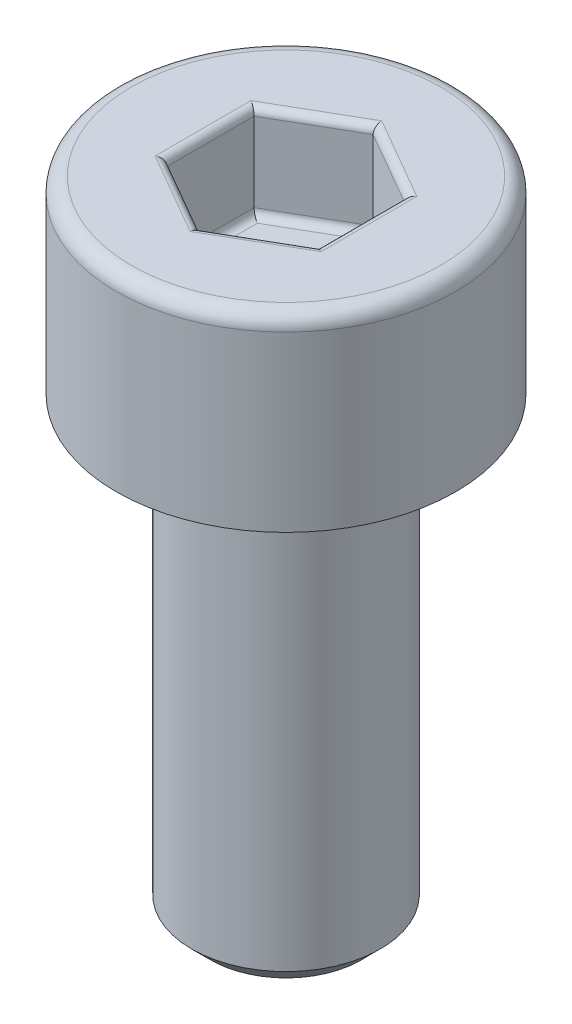
ISO-10303-21;
HEADER;
FILE_DESCRIPTION(('STEP AP214'),'2;1');
FILE_NAME('part.step','',(''),(''),'','','');
FILE_SCHEMA(('AUTOMOTIVE_DESIGN { 1 0 10303 214 1 1 1 1 }'));
ENDSEC;
DATA;
#1=APPLICATION_CONTEXT('core data for automotive mechanical design processes');
#2=APPLICATION_PROTOCOL_DEFINITION('international standard','automotive_design',2000,#1);
#3=PRODUCT_CONTEXT('',#1,'mechanical');
#4=PRODUCT('Part','Part','',(#3));
#5=PRODUCT_RELATED_PRODUCT_CATEGORY('part','',(#4));
#6=PRODUCT_DEFINITION_FORMATION('','',#4);
#7=PRODUCT_DEFINITION_CONTEXT('part definition',#1,'design');
#8=PRODUCT_DEFINITION('design','',#6,#7);
#9=PRODUCT_DEFINITION_SHAPE('','',#8);
#10=(LENGTH_UNIT() NAMED_UNIT(*) SI_UNIT(.MILLI.,.METRE.));
#11=(NAMED_UNIT(*) PLANE_ANGLE_UNIT() SI_UNIT($,.RADIAN.));
#12=(NAMED_UNIT(*) SI_UNIT($,.STERADIAN.) SOLID_ANGLE_UNIT());
#13=UNCERTAINTY_MEASURE_WITH_UNIT(LENGTH_MEASURE(1.E-05),#10,'distance_accuracy_value','');
#14=(GEOMETRIC_REPRESENTATION_CONTEXT(3) GLOBAL_UNCERTAINTY_ASSIGNED_CONTEXT((#13)) GLOBAL_UNIT_ASSIGNED_CONTEXT((#10,
#11,#12)) REPRESENTATION_CONTEXT('',''));
#15=CARTESIAN_POINT('',(0.,0.,0.));
#16=DIRECTION('',(0.,0.,1.));
#17=DIRECTION('',(1.,0.,0.));
#18=AXIS2_PLACEMENT_3D('',#15,#16,#17);
#19=CARTESIAN_POINT('',(0.,-8.5,0.));
#20=DIRECTION('',(0.,-1.,0.));
#21=DIRECTION('',(0.,0.,-1.));
#22=AXIS2_PLACEMENT_3D('',#19,#20,#21);
#23=PLANE('',#22);
#24=CARTESIAN_POINT('',(0.,-8.5,0.));
#25=DIRECTION('',(0.,-1.,0.));
#26=DIRECTION('',(0.,0.,-1.));
#27=AXIS2_PLACEMENT_3D('',#24,#25,#26);
#28=CIRCLE('',#27,0.999999999999993);
#29=CARTESIAN_POINT('',(0.,-8.5,-0.999999999999993));
#30=VERTEX_POINT('',#29);
#31=EDGE_CURVE('E261',#30,#30,#28,.T.);
#32=ORIENTED_EDGE('',*,*,#31,.T.);
#33=EDGE_LOOP('',(#32));
#34=FACE_BOUND('',#33,.T.);
#35=ADVANCED_FACE('F33',(#34),#23,.T.);
#36=CARTESIAN_POINT('',(0.,0.,0.));
#37=DIRECTION('',(0.,1.,0.));
#38=DIRECTION('',(0.,0.,1.));
#39=AXIS2_PLACEMENT_3D('',#36,#37,#38);
#40=CYLINDRICAL_SURFACE('',#39,1.25);
#41=CARTESIAN_POINT('',(0.,-2.75,0.));
#42=DIRECTION('',(0.,-1.,0.));
#43=DIRECTION('',(0.,0.,-1.));
#44=AXIS2_PLACEMENT_3D('',#41,#42,#43);
#45=CIRCLE('',#44,1.25);
#46=CARTESIAN_POINT('',(0.,-2.75,-1.25));
#47=VERTEX_POINT('',#46);
#48=EDGE_CURVE('E258',#47,#47,#45,.T.);
#49=ORIENTED_EDGE('',*,*,#48,.T.);
#50=EDGE_LOOP('',(#49));
#51=FACE_BOUND('',#50,.T.);
#52=CARTESIAN_POINT('',(0.,-8.25,0.));
#53=DIRECTION('',(0.,-1.,0.));
#54=DIRECTION('',(0.,0.,-1.));
#55=AXIS2_PLACEMENT_3D('',#52,#53,#54);
#56=CIRCLE('',#55,1.25);
#57=CARTESIAN_POINT('',(0.,-8.25,-1.25));
#58=VERTEX_POINT('',#57);
#59=EDGE_CURVE('E255',#58,#58,#56,.F.);
#60=ORIENTED_EDGE('',*,*,#59,.T.);
#61=EDGE_LOOP('',(#60));
#62=FACE_BOUND('',#61,.T.);
#63=ADVANCED_FACE('F287',(#51,#62),#40,.T.);
#64=CARTESIAN_POINT('',(-1.25,-2.5,0.));
#65=DIRECTION('',(0.,-1.,0.));
#66=DIRECTION('',(0.,0.,-1.));
#67=AXIS2_PLACEMENT_3D('',#64,#65,#66);
#68=PLANE('',#67);
#69=CARTESIAN_POINT('',(0.,-2.5,0.));
#70=DIRECTION('',(0.,-1.,0.));
#71=DIRECTION('',(0.,0.,-1.));
#72=AXIS2_PLACEMENT_3D('',#69,#70,#71);
#73=CIRCLE('',#72,1.5);
#74=CARTESIAN_POINT('',(0.,-2.5,-1.5));
#75=VERTEX_POINT('',#74);
#76=EDGE_CURVE('E252',#75,#75,#73,.F.);
#77=ORIENTED_EDGE('',*,*,#76,.T.);
#78=EDGE_LOOP('',(#77));
#79=FACE_BOUND('',#78,.T.);
#80=CARTESIAN_POINT('',(0.,-2.5,0.));
#81=DIRECTION('',(0.,1.,0.));
#82=DIRECTION('',(0.,0.,1.));
#83=AXIS2_PLACEMENT_3D('',#80,#81,#82);
#84=CIRCLE('',#83,2.25);
#85=CARTESIAN_POINT('',(0.,-2.5,2.25));
#86=VERTEX_POINT('',#85);
#87=EDGE_CURVE('E249',#86,#86,#84,.T.);
#88=ORIENTED_EDGE('',*,*,#87,.F.);
#89=EDGE_LOOP('',(#88));
#90=FACE_BOUND('',#89,.T.);
#91=ADVANCED_FACE('F293',(#79,#90),#68,.T.);
#92=CARTESIAN_POINT('',(0.,0.,0.));
#93=DIRECTION('',(0.,1.,0.));
#94=DIRECTION('',(0.,0.,1.));
#95=AXIS2_PLACEMENT_3D('',#92,#93,#94);
#96=CYLINDRICAL_SURFACE('',#95,2.25);
#97=CARTESIAN_POINT('',(0.,-0.2,0.));
#98=DIRECTION('',(0.,1.,0.));
#99=DIRECTION('',(0.,0.,1.));
#100=AXIS2_PLACEMENT_3D('',#97,#98,#99);
#101=CIRCLE('',#100,2.25);
#102=CARTESIAN_POINT('',(0.,-0.2,2.25));
#103=VERTEX_POINT('',#102);
#104=EDGE_CURVE('E159',#103,#103,#101,.F.);
#105=ORIENTED_EDGE('',*,*,#104,.T.);
#106=EDGE_LOOP('',(#105));
#107=FACE_BOUND('',#106,.T.);
#108=ORIENTED_EDGE('',*,*,#87,.T.);
#109=EDGE_LOOP('',(#108));
#110=FACE_BOUND('',#109,.T.);
#111=ADVANCED_FACE('F303',(#107,#110),#96,.T.);
#112=CARTESIAN_POINT('',(-2.25,0.,0.));
#113=DIRECTION('',(0.,1.,0.));
#114=DIRECTION('',(0.,0.,1.));
#115=AXIS2_PLACEMENT_3D('',#112,#113,#114);
#116=PLANE('',#115);
#117=DIRECTION('',(0.,0.,1.));
#118=VECTOR('',#117,1.);
#119=CARTESIAN_POINT('',(-1.1,0.,-0.577350269189627));
#120=LINE('',#119,#118);
#121=CARTESIAN_POINT('',(-1.1,0.,0.635085296108588));
#122=VERTEX_POINT('',#121);
#123=CARTESIAN_POINT('',(-1.1,0.,-0.635085296108589));
#124=VERTEX_POINT('',#123);
#125=EDGE_CURVE('E175',#122,#124,#120,.F.);
#126=ORIENTED_EDGE('',*,*,#125,.T.);
#127=DIRECTION('',(-0.866025403784439,0.,0.5));
#128=VECTOR('',#127,1.);
#129=CARTESIAN_POINT('',(-0.0500000000000009,0.,-1.2413030787577));
#130=LINE('',#129,#128);
#131=CARTESIAN_POINT('',(0.,0.,-1.27017059221718));
#132=VERTEX_POINT('',#131);
#133=EDGE_CURVE('E134',#124,#132,#130,.F.);
#134=ORIENTED_EDGE('',*,*,#133,.T.);
#135=DIRECTION('',(-0.866025403784439,0.,-0.5));
#136=VECTOR('',#135,1.);
#137=CARTESIAN_POINT('',(1.05,0.,-0.663952809568071));
#138=LINE('',#137,#136);
#139=CARTESIAN_POINT('',(1.1,0.,-0.63508529610859));
#140=VERTEX_POINT('',#139);
#141=EDGE_CURVE('E161',#132,#140,#138,.F.);
#142=ORIENTED_EDGE('',*,*,#141,.T.);
#143=DIRECTION('',(0.,0.,-1.));
#144=VECTOR('',#143,1.);
#145=CARTESIAN_POINT('',(1.1,0.,0.577350269189625));
#146=LINE('',#145,#144);
#147=CARTESIAN_POINT('',(1.1,0.,0.635085296108588));
#148=VERTEX_POINT('',#147);
#149=EDGE_CURVE('E169',#140,#148,#146,.F.);
#150=ORIENTED_EDGE('',*,*,#149,.T.);
#151=DIRECTION('',(0.866025403784439,0.,-0.5));
#152=VECTOR('',#151,1.);
#153=CARTESIAN_POINT('',(0.0499999999999991,0.,1.24130307875769));
#154=LINE('',#153,#152);
#155=CARTESIAN_POINT('',(0.,0.,1.27017059221718));
#156=VERTEX_POINT('',#155);
#157=EDGE_CURVE('E171',#148,#156,#154,.F.);
#158=ORIENTED_EDGE('',*,*,#157,.T.);
#159=DIRECTION('',(0.866025403784439,0.,0.5));
#160=VECTOR('',#159,1.);
#161=CARTESIAN_POINT('',(-1.05,0.,0.663952809568069));
#162=LINE('',#161,#160);
#163=EDGE_CURVE('E173',#156,#122,#162,.F.);
#164=ORIENTED_EDGE('',*,*,#163,.T.);
#165=EDGE_LOOP('',(#126,#134,#142,#150,#158,#164));
#166=FACE_BOUND('',#165,.T.);
#167=CARTESIAN_POINT('',(0.,0.,0.));
#168=DIRECTION('',(0.,1.,0.));
#169=DIRECTION('',(0.,0.,1.));
#170=AXIS2_PLACEMENT_3D('',#167,#168,#169);
#171=CIRCLE('',#170,2.05);
#172=CARTESIAN_POINT('',(0.,0.,2.05));
#173=VERTEX_POINT('',#172);
#174=EDGE_CURVE('E164',#173,#173,#171,.T.);
#175=ORIENTED_EDGE('',*,*,#174,.T.);
#176=EDGE_LOOP('',(#175));
#177=FACE_BOUND('',#176,.T.);
#178=ADVANCED_FACE('F266',(#166,#177),#116,.T.);
#179=CARTESIAN_POINT('',(0.,-2.5,0.));
#180=DIRECTION('',(0.,1.,0.));
#181=DIRECTION('',(0.,0.,1.));
#182=AXIS2_PLACEMENT_3D('',#179,#180,#181);
#183=CONICAL_SURFACE('',#182,1.5,0.785398163397454);
#184=ORIENTED_EDGE('',*,*,#48,.F.);
#185=EDGE_LOOP('',(#184));
#186=FACE_BOUND('',#185,.T.);
#187=ORIENTED_EDGE('',*,*,#76,.F.);
#188=EDGE_LOOP('',(#187));
#189=FACE_BOUND('',#188,.T.);
#190=ADVANCED_FACE('F281',(#186,#189),#183,.T.);
#191=CARTESIAN_POINT('',(0.,-8.25,0.));
#192=DIRECTION('',(0.,1.,0.));
#193=DIRECTION('',(0.,0.,1.));
#194=AXIS2_PLACEMENT_3D('',#191,#192,#193);
#195=CONICAL_SURFACE('',#194,1.25,0.785398163397456);
#196=ORIENTED_EDGE('',*,*,#31,.F.);
#197=EDGE_LOOP('',(#196));
#198=FACE_BOUND('',#197,.T.);
#199=ORIENTED_EDGE('',*,*,#59,.F.);
#200=EDGE_LOOP('',(#199));
#201=FACE_BOUND('',#200,.T.);
#202=ADVANCED_FACE('F271',(#198,#201),#195,.T.);
#203=CARTESIAN_POINT('',(0.,-0.2,0.));
#204=DIRECTION('',(0.,1.,0.));
#205=DIRECTION('',(0.,0.,1.));
#206=AXIS2_PLACEMENT_3D('',#203,#204,#205);
#207=TOROIDAL_SURFACE('',#206,2.05,0.2);
#208=ORIENTED_EDGE('',*,*,#104,.F.);
#209=EDGE_LOOP('',(#208));
#210=FACE_BOUND('',#209,.T.);
#211=ORIENTED_EDGE('',*,*,#174,.F.);
#212=EDGE_LOOP('',(#211));
#213=FACE_BOUND('',#212,.T.);
#214=ADVANCED_FACE('F268',(#210,#213),#207,.T.);
#215=CARTESIAN_POINT('',(0.999999999999998,-1.25,-0.577350269189627));
#216=DIRECTION('',(0.5,0.,-0.866025403784439));
#217=DIRECTION('',(-0.866025403784439,0.,-0.5));
#218=AXIS2_PLACEMENT_3D('',#215,#216,#217);
#219=PLANE('',#218);
#220=DIRECTION('',(0.,1.,0.));
#221=VECTOR('',#220,1.);
#222=CARTESIAN_POINT('',(0.999999999999998,-1.25,-0.577350269189627));
#223=LINE('',#222,#221);
#224=CARTESIAN_POINT('',(0.999999999999998,-1.15,-0.577350269189627));
#225=VERTEX_POINT('',#224);
#226=CARTESIAN_POINT('',(0.999999999999998,-0.1,-0.577350269189627));
#227=VERTEX_POINT('',#226);
#228=EDGE_CURVE('E243',#225,#227,#223,.T.);
#229=ORIENTED_EDGE('',*,*,#228,.T.);
#230=DIRECTION('',(-0.866025403784439,0.,-0.5));
#231=VECTOR('',#230,1.);
#232=CARTESIAN_POINT('',(0.,-0.1,-1.15470053837925));
#233=LINE('',#232,#231);
#234=CARTESIAN_POINT('',(0.,-0.1,-1.15470053837925));
#235=VERTEX_POINT('',#234);
#236=EDGE_CURVE('E195',#227,#235,#233,.T.);
#237=ORIENTED_EDGE('',*,*,#236,.T.);
#238=DIRECTION('',(0.,1.,0.));
#239=VECTOR('',#238,1.);
#240=CARTESIAN_POINT('',(0.,-1.25,-1.15470053837925));
#241=LINE('',#240,#239);
#242=CARTESIAN_POINT('',(0.,-1.15,-1.15470053837925));
#243=VERTEX_POINT('',#242);
#244=EDGE_CURVE('E145',#243,#235,#241,.T.);
#245=ORIENTED_EDGE('',*,*,#244,.F.);
#246=DIRECTION('',(-0.866025403784439,0.,-0.5));
#247=VECTOR('',#246,1.);
#248=CARTESIAN_POINT('',(0.999999999999998,-1.15,-0.577350269189627));
#249=LINE('',#248,#247);
#250=EDGE_CURVE('E193',#243,#225,#249,.F.);
#251=ORIENTED_EDGE('',*,*,#250,.T.);
#252=EDGE_LOOP('',(#229,#237,#245,#251));
#253=FACE_BOUND('',#252,.T.);
#254=ADVANCED_FACE('F270',(#253),#219,.F.);
#255=CARTESIAN_POINT('',(0.999999999999999,-1.25,0.577350269189625));
#256=DIRECTION('',(1.,0.,0.));
#257=DIRECTION('',(0.,0.,-1.));
#258=AXIS2_PLACEMENT_3D('',#255,#256,#257);
#259=PLANE('',#258);
#260=DIRECTION('',(0.,1.,0.));
#261=VECTOR('',#260,1.);
#262=CARTESIAN_POINT('',(0.999999999999999,-1.25,0.577350269189625));
#263=LINE('',#262,#261);
#264=CARTESIAN_POINT('',(0.999999999999999,-1.15,0.577350269189625));
#265=VERTEX_POINT('',#264);
#266=CARTESIAN_POINT('',(0.999999999999999,-0.1,0.577350269189625));
#267=VERTEX_POINT('',#266);
#268=EDGE_CURVE('E240',#265,#267,#263,.T.);
#269=ORIENTED_EDGE('',*,*,#268,.T.);
#270=DIRECTION('',(0.,0.,-1.));
#271=VECTOR('',#270,1.);
#272=CARTESIAN_POINT('',(0.999999999999998,-0.1,-0.577350269189627));
#273=LINE('',#272,#271);
#274=EDGE_CURVE('E191',#267,#227,#273,.T.);
#275=ORIENTED_EDGE('',*,*,#274,.T.);
#276=ORIENTED_EDGE('',*,*,#228,.F.);
#277=DIRECTION('',(0.,0.,-1.));
#278=VECTOR('',#277,1.);
#279=CARTESIAN_POINT('',(0.999999999999999,-1.15,0.577350269189625));
#280=LINE('',#279,#278);
#281=EDGE_CURVE('E188',#225,#265,#280,.F.);
#282=ORIENTED_EDGE('',*,*,#281,.T.);
#283=EDGE_LOOP('',(#269,#275,#276,#282));
#284=FACE_BOUND('',#283,.T.);
#285=ADVANCED_FACE('F278',(#284),#259,.F.);
#286=CARTESIAN_POINT('',(0.,-1.25,1.15470053837925));
#287=DIRECTION('',(0.5,0.,0.866025403784439));
#288=DIRECTION('',(0.866025403784439,0.,-0.5));
#289=AXIS2_PLACEMENT_3D('',#286,#287,#288);
#290=PLANE('',#289);
#291=DIRECTION('',(0.,1.,0.));
#292=VECTOR('',#291,1.);
#293=CARTESIAN_POINT('',(0.,-1.25,1.15470053837925));
#294=LINE('',#293,#292);
#295=CARTESIAN_POINT('',(0.,-1.15,1.15470053837925));
#296=VERTEX_POINT('',#295);
#297=CARTESIAN_POINT('',(0.,-0.1,1.15470053837925));
#298=VERTEX_POINT('',#297);
#299=EDGE_CURVE('E237',#296,#298,#294,.T.);
#300=ORIENTED_EDGE('',*,*,#299,.T.);
#301=DIRECTION('',(0.866025403784439,0.,-0.5));
#302=VECTOR('',#301,1.);
#303=CARTESIAN_POINT('',(0.999999999999999,-0.1,0.577350269189625));
#304=LINE('',#303,#302);
#305=EDGE_CURVE('E186',#298,#267,#304,.T.);
#306=ORIENTED_EDGE('',*,*,#305,.T.);
#307=ORIENTED_EDGE('',*,*,#268,.F.);
#308=DIRECTION('',(0.866025403784439,0.,-0.5));
#309=VECTOR('',#308,1.);
#310=CARTESIAN_POINT('',(0.,-1.15,1.15470053837925));
#311=LINE('',#310,#309);
#312=EDGE_CURVE('E184',#265,#296,#311,.F.);
#313=ORIENTED_EDGE('',*,*,#312,.T.);
#314=EDGE_LOOP('',(#300,#306,#307,#313));
#315=FACE_BOUND('',#314,.T.);
#316=ADVANCED_FACE('F327',(#315),#290,.F.);
#317=CARTESIAN_POINT('',(-1.,-1.25,0.577350269189625));
#318=DIRECTION('',(-0.5,0.,0.866025403784438));
#319=DIRECTION('',(0.866025403784439,0.,0.5));
#320=AXIS2_PLACEMENT_3D('',#317,#318,#319);
#321=PLANE('',#320);
#322=DIRECTION('',(0.,1.,0.));
#323=VECTOR('',#322,1.);
#324=CARTESIAN_POINT('',(-1.,-1.25,0.577350269189625));
#325=LINE('',#324,#323);
#326=CARTESIAN_POINT('',(-1.,-1.15,0.577350269189625));
#327=VERTEX_POINT('',#326);
#328=CARTESIAN_POINT('',(-1.,-0.1,0.577350269189625));
#329=VERTEX_POINT('',#328);
#330=EDGE_CURVE('E128',#327,#329,#325,.T.);
#331=ORIENTED_EDGE('',*,*,#330,.T.);
#332=DIRECTION('',(0.866025403784439,0.,0.5));
#333=VECTOR('',#332,1.);
#334=CARTESIAN_POINT('',(0.,-0.1,1.15470053837925));
#335=LINE('',#334,#333);
#336=EDGE_CURVE('E182',#329,#298,#335,.T.);
#337=ORIENTED_EDGE('',*,*,#336,.T.);
#338=ORIENTED_EDGE('',*,*,#299,.F.);
#339=DIRECTION('',(0.866025403784439,0.,0.5));
#340=VECTOR('',#339,1.);
#341=CARTESIAN_POINT('',(-1.,-1.15,0.577350269189625));
#342=LINE('',#341,#340);
#343=EDGE_CURVE('E180',#296,#327,#342,.F.);
#344=ORIENTED_EDGE('',*,*,#343,.T.);
#345=EDGE_LOOP('',(#331,#337,#338,#344));
#346=FACE_BOUND('',#345,.T.);
#347=ADVANCED_FACE('F234',(#346),#321,.F.);
#348=CARTESIAN_POINT('',(-1.,-1.25,-0.577350269189627));
#349=DIRECTION('',(-1.,0.,0.));
#350=DIRECTION('',(0.,0.,1.));
#351=AXIS2_PLACEMENT_3D('',#348,#349,#350);
#352=PLANE('',#351);
#353=DIRECTION('',(0.,1.,0.));
#354=VECTOR('',#353,1.);
#355=CARTESIAN_POINT('',(-1.,-1.25,-0.577350269189627));
#356=LINE('',#355,#354);
#357=CARTESIAN_POINT('',(-1.,-1.15,-0.577350269189627));
#358=VERTEX_POINT('',#357);
#359=CARTESIAN_POINT('',(-1.,-0.1,-0.577350269189627));
#360=VERTEX_POINT('',#359);
#361=EDGE_CURVE('E126',#358,#360,#356,.T.);
#362=ORIENTED_EDGE('',*,*,#361,.T.);
#363=DIRECTION('',(0.,0.,1.));
#364=VECTOR('',#363,1.);
#365=CARTESIAN_POINT('',(-1.,-0.1,0.577350269189625));
#366=LINE('',#365,#364);
#367=EDGE_CURVE('E133',#360,#329,#366,.T.);
#368=ORIENTED_EDGE('',*,*,#367,.T.);
#369=ORIENTED_EDGE('',*,*,#330,.F.);
#370=DIRECTION('',(0.,0.,1.));
#371=VECTOR('',#370,1.);
#372=CARTESIAN_POINT('',(-1.,-1.15,-0.577350269189627));
#373=LINE('',#372,#371);
#374=EDGE_CURVE('E123',#327,#358,#373,.F.);
#375=ORIENTED_EDGE('',*,*,#374,.T.);
#376=EDGE_LOOP('',(#362,#368,#369,#375));
#377=FACE_BOUND('',#376,.T.);
#378=ADVANCED_FACE('F125',(#377),#352,.F.);
#379=CARTESIAN_POINT('',(0.,-1.25,-1.15470053837925));
#380=DIRECTION('',(-0.5,0.,-0.866025403784438));
#381=DIRECTION('',(-0.866025403784439,0.,0.5));
#382=AXIS2_PLACEMENT_3D('',#379,#380,#381);
#383=PLANE('',#382);
#384=ORIENTED_EDGE('',*,*,#244,.T.);
#385=DIRECTION('',(-0.866025403784439,0.,0.5));
#386=VECTOR('',#385,1.);
#387=CARTESIAN_POINT('',(-1.,-0.1,-0.577350269189626));
#388=LINE('',#387,#386);
#389=EDGE_CURVE('E144',#235,#360,#388,.T.);
#390=ORIENTED_EDGE('',*,*,#389,.T.);
#391=ORIENTED_EDGE('',*,*,#361,.F.);
#392=DIRECTION('',(-0.866025403784439,0.,0.5));
#393=VECTOR('',#392,1.);
#394=CARTESIAN_POINT('',(0.,-1.15,-1.15470053837925));
#395=LINE('',#394,#393);
#396=EDGE_CURVE('E141',#358,#243,#395,.F.);
#397=ORIENTED_EDGE('',*,*,#396,.T.);
#398=EDGE_LOOP('',(#384,#390,#391,#397));
#399=FACE_BOUND('',#398,.T.);
#400=ADVANCED_FACE('F139',(#399),#383,.F.);
#401=CARTESIAN_POINT('',(0.,-1.25,-1.15470053837925));
#402=DIRECTION('',(0.,1.,0.));
#403=DIRECTION('',(0.,0.,1.));
#404=AXIS2_PLACEMENT_3D('',#401,#402,#403);
#405=PLANE('',#404);
#406=DIRECTION('',(0.866025403784439,0.,-0.5));
#407=VECTOR('',#406,1.);
#408=CARTESIAN_POINT('',(0.949999999999999,-1.25,0.490747728811181));
#409=LINE('',#408,#407);
#410=CARTESIAN_POINT('',(0.,-1.25,1.03923048454133));
#411=VERTEX_POINT('',#410);
#412=CARTESIAN_POINT('',(0.899999999999999,-1.25,0.519615242270663));
#413=VERTEX_POINT('',#412);
#414=EDGE_CURVE('E42',#411,#413,#409,.T.);
#415=ORIENTED_EDGE('',*,*,#414,.T.);
#416=DIRECTION('',(0.,0.,-1.));
#417=VECTOR('',#416,1.);
#418=CARTESIAN_POINT('',(0.899999999999998,-1.25,-1.15470053837925));
#419=LINE('',#418,#417);
#420=CARTESIAN_POINT('',(0.899999999999998,-1.25,-0.519615242270664));
#421=VERTEX_POINT('',#420);
#422=EDGE_CURVE('E11',#413,#421,#419,.T.);
#423=ORIENTED_EDGE('',*,*,#422,.T.);
#424=DIRECTION('',(-0.866025403784439,0.,-0.5));
#425=VECTOR('',#424,1.);
#426=CARTESIAN_POINT('',(-0.0500000000000008,-1.25,-1.06809799800081));
#427=LINE('',#426,#425);
#428=CARTESIAN_POINT('',(0.,-1.25,-1.03923048454133));
#429=VERTEX_POINT('',#428);
#430=EDGE_CURVE('E197',#421,#429,#427,.T.);
#431=ORIENTED_EDGE('',*,*,#430,.T.);
#432=DIRECTION('',(-0.866025403784439,0.,0.5));
#433=VECTOR('',#432,1.);
#434=CARTESIAN_POINT('',(0.0499999999999993,-1.25,-1.06809799800081));
#435=LINE('',#434,#433);
#436=CARTESIAN_POINT('',(-0.9,-1.25,-0.519615242270664));
#437=VERTEX_POINT('',#436);
#438=EDGE_CURVE('E199',#429,#437,#435,.T.);
#439=ORIENTED_EDGE('',*,*,#438,.T.);
#440=DIRECTION('',(0.,0.,1.));
#441=VECTOR('',#440,1.);
#442=CARTESIAN_POINT('',(-0.9,-1.25,-1.15470053837925));
#443=LINE('',#442,#441);
#444=CARTESIAN_POINT('',(-0.9,-1.25,0.519615242270662));
#445=VERTEX_POINT('',#444);
#446=EDGE_CURVE('E150',#437,#445,#443,.T.);
#447=ORIENTED_EDGE('',*,*,#446,.T.);
#448=DIRECTION('',(0.866025403784439,0.,0.5));
#449=VECTOR('',#448,1.);
#450=CARTESIAN_POINT('',(-0.950000000000001,-1.25,0.490747728811181));
#451=LINE('',#450,#449);
#452=EDGE_CURVE('E53',#445,#411,#451,.T.);
#453=ORIENTED_EDGE('',*,*,#452,.T.);
#454=EDGE_LOOP('',(#415,#423,#431,#439,#447,#453));
#455=FACE_BOUND('',#454,.T.);
#456=ADVANCED_FACE('F322',(#455),#405,.T.);
#457=CARTESIAN_POINT('',(0.0499999999999991,-0.1,1.24130307875769));
#458=DIRECTION('',(-0.866025403784439,0.,0.5));
#459=DIRECTION('',(0.5,0.,0.866025403784439));
#460=AXIS2_PLACEMENT_3D('',#457,#458,#459);
#461=CYLINDRICAL_SURFACE('',#460,0.1);
#462=CARTESIAN_POINT('',(0.,-0.1,1.27017059221718));
#463=DIRECTION('',(-1.,0.,0.));
#464=DIRECTION('',(0.,0.,-1.));
#465=AXIS2_PLACEMENT_3D('',#462,#463,#464);
#466=ELLIPSE('',#465,0.115470053837925,0.1);
#467=EDGE_CURVE('E214',#156,#298,#466,.T.);
#468=ORIENTED_EDGE('',*,*,#467,.F.);
#469=ORIENTED_EDGE('',*,*,#157,.F.);
#470=CARTESIAN_POINT('',(1.1,-0.1,0.635085296108588));
#471=DIRECTION('',(-0.5,0.,0.866025403784439));
#472=DIRECTION('',(-0.866025403784439,0.,-0.5));
#473=AXIS2_PLACEMENT_3D('',#470,#471,#472);
#474=ELLIPSE('',#473,0.115470053837925,0.1);
#475=EDGE_CURVE('E217',#267,#148,#474,.F.);
#476=ORIENTED_EDGE('',*,*,#475,.F.);
#477=ORIENTED_EDGE('',*,*,#305,.F.);
#478=EDGE_LOOP('',(#468,#469,#476,#477));
#479=FACE_BOUND('',#478,.T.);
#480=ADVANCED_FACE('F334',(#479),#461,.T.);
#481=CARTESIAN_POINT('',(1.1,-0.1,0.577350269189625));
#482=DIRECTION('',(0.,0.,1.));
#483=DIRECTION('',(1.,0.,0.));
#484=AXIS2_PLACEMENT_3D('',#481,#482,#483);
#485=CYLINDRICAL_SURFACE('',#484,0.1);
#486=ORIENTED_EDGE('',*,*,#475,.T.);
#487=ORIENTED_EDGE('',*,*,#149,.F.);
#488=CARTESIAN_POINT('',(1.1,-0.1,-0.63508529610859));
#489=DIRECTION('',(0.5,0.,0.866025403784439));
#490=DIRECTION('',(-0.866025403784439,0.,0.5));
#491=AXIS2_PLACEMENT_3D('',#488,#489,#490);
#492=ELLIPSE('',#491,0.115470053837925,0.1);
#493=EDGE_CURVE('E211',#227,#140,#492,.F.);
#494=ORIENTED_EDGE('',*,*,#493,.F.);
#495=ORIENTED_EDGE('',*,*,#274,.F.);
#496=EDGE_LOOP('',(#486,#487,#494,#495));
#497=FACE_BOUND('',#496,.T.);
#498=ADVANCED_FACE('F338',(#497),#485,.T.);
#499=CARTESIAN_POINT('',(-1.05,-0.1,0.663952809568069));
#500=DIRECTION('',(-0.866025403784439,0.,-0.5));
#501=DIRECTION('',(-0.5,0.,0.866025403784438));
#502=AXIS2_PLACEMENT_3D('',#499,#500,#501);
#503=CYLINDRICAL_SURFACE('',#502,0.1);
#504=ORIENTED_EDGE('',*,*,#467,.T.);
#505=ORIENTED_EDGE('',*,*,#336,.F.);
#506=CARTESIAN_POINT('',(-1.1,-0.1,0.635085296108587));
#507=DIRECTION('',(-0.5,0.,-0.866025403784439));
#508=DIRECTION('',(0.866025403784439,0.,-0.5));
#509=AXIS2_PLACEMENT_3D('',#506,#507,#508);
#510=ELLIPSE('',#509,0.115470053837925,0.1);
#511=EDGE_CURVE('E208',#122,#329,#510,.T.);
#512=ORIENTED_EDGE('',*,*,#511,.F.);
#513=ORIENTED_EDGE('',*,*,#163,.F.);
#514=EDGE_LOOP('',(#504,#505,#512,#513));
#515=FACE_BOUND('',#514,.T.);
#516=ADVANCED_FACE('F344',(#515),#503,.T.);
#517=CARTESIAN_POINT('',(1.05,-0.1,-0.663952809568071));
#518=DIRECTION('',(0.866025403784439,0.,0.5));
#519=DIRECTION('',(0.5,0.,-0.866025403784439));
#520=AXIS2_PLACEMENT_3D('',#517,#518,#519);
#521=CYLINDRICAL_SURFACE('',#520,0.1);
#522=ORIENTED_EDGE('',*,*,#493,.T.);
#523=ORIENTED_EDGE('',*,*,#141,.F.);
#524=CARTESIAN_POINT('',(0.,-0.1,-1.27017059221718));
#525=DIRECTION('',(1.,0.,0.));
#526=DIRECTION('',(0.,0.,-1.));
#527=AXIS2_PLACEMENT_3D('',#524,#525,#526);
#528=ELLIPSE('',#527,0.115470053837925,0.1);
#529=EDGE_CURVE('E206',#235,#132,#528,.F.);
#530=ORIENTED_EDGE('',*,*,#529,.F.);
#531=ORIENTED_EDGE('',*,*,#236,.F.);
#532=EDGE_LOOP('',(#522,#523,#530,#531));
#533=FACE_BOUND('',#532,.T.);
#534=ADVANCED_FACE('F374',(#533),#521,.T.);
#535=CARTESIAN_POINT('',(-1.1,-0.1,-0.577350269189627));
#536=DIRECTION('',(0.,0.,-1.));
#537=DIRECTION('',(-1.,0.,0.));
#538=AXIS2_PLACEMENT_3D('',#535,#536,#537);
#539=CYLINDRICAL_SURFACE('',#538,0.1);
#540=ORIENTED_EDGE('',*,*,#511,.T.);
#541=ORIENTED_EDGE('',*,*,#367,.F.);
#542=CARTESIAN_POINT('',(-1.1,-0.1,-0.635085296108589));
#543=DIRECTION('',(0.5,0.,-0.866025403784439));
#544=DIRECTION('',(0.866025403784439,0.,0.5));
#545=AXIS2_PLACEMENT_3D('',#542,#543,#544);
#546=ELLIPSE('',#545,0.115470053837925,0.1);
#547=EDGE_CURVE('E204',#124,#360,#546,.T.);
#548=ORIENTED_EDGE('',*,*,#547,.F.);
#549=ORIENTED_EDGE('',*,*,#125,.F.);
#550=EDGE_LOOP('',(#540,#541,#548,#549));
#551=FACE_BOUND('',#550,.T.);
#552=ADVANCED_FACE('F369',(#551),#539,.T.);
#553=CARTESIAN_POINT('',(-0.0500000000000009,-0.1,-1.2413030787577));
#554=DIRECTION('',(0.866025403784439,0.,-0.5));
#555=DIRECTION('',(-0.5,0.,-0.866025403784438));
#556=AXIS2_PLACEMENT_3D('',#553,#554,#555);
#557=CYLINDRICAL_SURFACE('',#556,0.1);
#558=ORIENTED_EDGE('',*,*,#529,.T.);
#559=ORIENTED_EDGE('',*,*,#133,.F.);
#560=ORIENTED_EDGE('',*,*,#547,.T.);
#561=ORIENTED_EDGE('',*,*,#389,.F.);
#562=EDGE_LOOP('',(#558,#559,#560,#561));
#563=FACE_BOUND('',#562,.T.);
#564=ADVANCED_FACE('F365',(#563),#557,.T.);
#565=CARTESIAN_POINT('',(-0.9,-1.15,-1.15470053837925));
#566=DIRECTION('',(0.,0.,1.));
#567=DIRECTION('',(1.,0.,0.));
#568=AXIS2_PLACEMENT_3D('',#565,#566,#567);
#569=CYLINDRICAL_SURFACE('',#568,0.1);
#570=CARTESIAN_POINT('',(-0.900000000000001,-1.15,-0.519615242270664));
#571=DIRECTION('',(-0.5,0.,0.866025403784439));
#572=DIRECTION('',(0.866025403784439,0.,0.5));
#573=AXIS2_PLACEMENT_3D('',#570,#571,#572);
#574=ELLIPSE('',#573,0.115470053837925,0.1);
#575=EDGE_CURVE('E149',#358,#437,#574,.T.);
#576=ORIENTED_EDGE('',*,*,#575,.F.);
#577=ORIENTED_EDGE('',*,*,#374,.F.);
#578=CARTESIAN_POINT('',(-0.9,-1.15,0.519615242270662));
#579=DIRECTION('',(0.5,0.,0.866025403784439));
#580=DIRECTION('',(0.866025403784439,0.,-0.5));
#581=AXIS2_PLACEMENT_3D('',#578,#579,#580);
#582=ELLIPSE('',#581,0.115470053837925,0.1);
#583=EDGE_CURVE('E37',#445,#327,#582,.F.);
#584=ORIENTED_EDGE('',*,*,#583,.F.);
#585=ORIENTED_EDGE('',*,*,#446,.F.);
#586=EDGE_LOOP('',(#576,#577,#584,#585));
#587=FACE_BOUND('',#586,.T.);
#588=ADVANCED_FACE('F35',(#587),#569,.F.);
#589=CARTESIAN_POINT('',(-0.950000000000001,-1.15,0.490747728811181));
#590=DIRECTION('',(0.866025403784439,0.,0.5));
#591=DIRECTION('',(0.5,0.,-0.866025403784438));
#592=AXIS2_PLACEMENT_3D('',#589,#590,#591);
#593=CYLINDRICAL_SURFACE('',#592,0.1);
#594=ORIENTED_EDGE('',*,*,#583,.T.);
#595=ORIENTED_EDGE('',*,*,#343,.F.);
#596=CARTESIAN_POINT('',(0.,-1.15,1.03923048454133));
#597=DIRECTION('',(1.,0.,0.));
#598=DIRECTION('',(0.,0.,-1.));
#599=AXIS2_PLACEMENT_3D('',#596,#597,#598);
#600=ELLIPSE('',#599,0.115470053837925,0.1);
#601=EDGE_CURVE('E153',#411,#296,#600,.F.);
#602=ORIENTED_EDGE('',*,*,#601,.F.);
#603=ORIENTED_EDGE('',*,*,#452,.F.);
#604=EDGE_LOOP('',(#594,#595,#602,#603));
#605=FACE_BOUND('',#604,.T.);
#606=ADVANCED_FACE('F231',(#605),#593,.F.);
#607=CARTESIAN_POINT('',(0.0499999999999993,-1.15,-1.06809799800081));
#608=DIRECTION('',(-0.866025403784439,0.,0.5));
#609=DIRECTION('',(0.5,0.,0.866025403784438));
#610=AXIS2_PLACEMENT_3D('',#607,#608,#609);
#611=CYLINDRICAL_SURFACE('',#610,0.1);
#612=ORIENTED_EDGE('',*,*,#575,.T.);
#613=ORIENTED_EDGE('',*,*,#438,.F.);
#614=CARTESIAN_POINT('',(0.,-1.15,-1.03923048454133));
#615=DIRECTION('',(-1.,0.,0.));
#616=DIRECTION('',(0.,0.,1.));
#617=AXIS2_PLACEMENT_3D('',#614,#615,#616);
#618=ELLIPSE('',#617,0.115470053837925,0.1);
#619=EDGE_CURVE('E157',#243,#429,#618,.T.);
#620=ORIENTED_EDGE('',*,*,#619,.F.);
#621=ORIENTED_EDGE('',*,*,#396,.F.);
#622=EDGE_LOOP('',(#612,#613,#620,#621));
#623=FACE_BOUND('',#622,.T.);
#624=ADVANCED_FACE('F155',(#623),#611,.F.);
#625=CARTESIAN_POINT('',(0.949999999999999,-1.15,0.490747728811181));
#626=DIRECTION('',(0.866025403784439,0.,-0.5));
#627=DIRECTION('',(-0.5,0.,-0.866025403784439));
#628=AXIS2_PLACEMENT_3D('',#625,#626,#627);
#629=CYLINDRICAL_SURFACE('',#628,0.1);
#630=ORIENTED_EDGE('',*,*,#601,.T.);
#631=ORIENTED_EDGE('',*,*,#312,.F.);
#632=CARTESIAN_POINT('',(0.899999999999999,-1.15,0.519615242270662));
#633=DIRECTION('',(0.5,0.,-0.866025403784439));
#634=DIRECTION('',(-0.866025403784439,0.,-0.5));
#635=AXIS2_PLACEMENT_3D('',#632,#633,#634);
#636=ELLIPSE('',#635,0.115470053837925,0.1);
#637=EDGE_CURVE('E222',#413,#265,#636,.F.);
#638=ORIENTED_EDGE('',*,*,#637,.F.);
#639=ORIENTED_EDGE('',*,*,#414,.F.);
#640=EDGE_LOOP('',(#630,#631,#638,#639));
#641=FACE_BOUND('',#640,.T.);
#642=ADVANCED_FACE('F228',(#641),#629,.F.);
#643=CARTESIAN_POINT('',(-0.0500000000000008,-1.15,-1.06809799800081));
#644=DIRECTION('',(-0.866025403784439,0.,-0.5));
#645=DIRECTION('',(-0.5,0.,0.866025403784439));
#646=AXIS2_PLACEMENT_3D('',#643,#644,#645);
#647=CYLINDRICAL_SURFACE('',#646,0.1);
#648=ORIENTED_EDGE('',*,*,#619,.T.);
#649=ORIENTED_EDGE('',*,*,#430,.F.);
#650=CARTESIAN_POINT('',(0.899999999999998,-1.15,-0.519615242270664));
#651=DIRECTION('',(-0.5,0.,-0.866025403784439));
#652=DIRECTION('',(0.866025403784439,0.,-0.5));
#653=AXIS2_PLACEMENT_3D('',#650,#651,#652);
#654=ELLIPSE('',#653,0.115470053837925,0.1);
#655=EDGE_CURVE('E220',#225,#421,#654,.T.);
#656=ORIENTED_EDGE('',*,*,#655,.F.);
#657=ORIENTED_EDGE('',*,*,#250,.F.);
#658=EDGE_LOOP('',(#648,#649,#656,#657));
#659=FACE_BOUND('',#658,.T.);
#660=ADVANCED_FACE('F353',(#659),#647,.F.);
#661=CARTESIAN_POINT('',(0.899999999999998,-1.15,-1.15470053837925));
#662=DIRECTION('',(0.,0.,-1.));
#663=DIRECTION('',(-1.,0.,0.));
#664=AXIS2_PLACEMENT_3D('',#661,#662,#663);
#665=CYLINDRICAL_SURFACE('',#664,0.1);
#666=ORIENTED_EDGE('',*,*,#637,.T.);
#667=ORIENTED_EDGE('',*,*,#281,.F.);
#668=ORIENTED_EDGE('',*,*,#655,.T.);
#669=ORIENTED_EDGE('',*,*,#422,.F.);
#670=EDGE_LOOP('',(#666,#667,#668,#669));
#671=FACE_BOUND('',#670,.T.);
#672=ADVANCED_FACE('F350',(#671),#665,.F.);
#673=CLOSED_SHELL('',(#35,#63,#91,#111,#178,#190,#202,#214,#254,#285,#316,#347,#378,#400,#456,
#480,#498,#516,#534,#552,#564,#588,#606,#624,#642,#660,#672));
#674=MANIFOLD_SOLID_BREP('B2',#673);
#675=ADVANCED_BREP_SHAPE_REPRESENTATION('',(#18,#674),#14);
#676=SHAPE_DEFINITION_REPRESENTATION(#9,#675);
ENDSEC;
END-ISO-10303-21;
